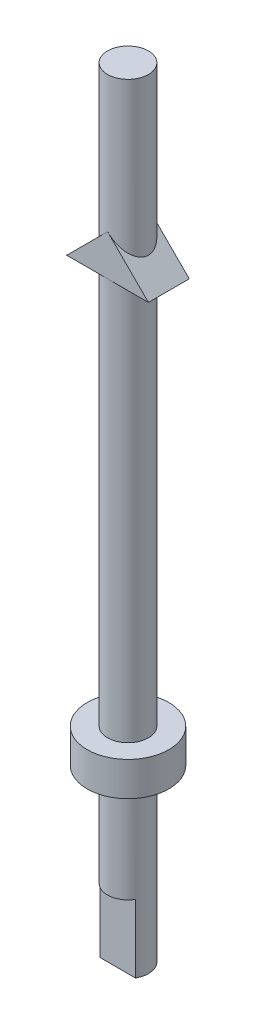
ISO-10303-21;
HEADER;
FILE_DESCRIPTION(('STEP AP214'),'2;1');
FILE_NAME('part.step','',(''),(''),'','','');
FILE_SCHEMA(('AUTOMOTIVE_DESIGN { 1 0 10303 214 1 1 1 1 }'));
ENDSEC;
DATA;
#1=APPLICATION_CONTEXT('core data for automotive mechanical design processes');
#2=APPLICATION_PROTOCOL_DEFINITION('international standard','automotive_design',2000,#1);
#3=PRODUCT_CONTEXT('',#1,'mechanical');
#4=PRODUCT('Part','Part','',(#3));
#5=PRODUCT_RELATED_PRODUCT_CATEGORY('part','',(#4));
#6=PRODUCT_DEFINITION_FORMATION('','',#4);
#7=PRODUCT_DEFINITION_CONTEXT('part definition',#1,'design');
#8=PRODUCT_DEFINITION('design','',#6,#7);
#9=PRODUCT_DEFINITION_SHAPE('','',#8);
#10=(LENGTH_UNIT() NAMED_UNIT(*) SI_UNIT(.MILLI.,.METRE.));
#11=(NAMED_UNIT(*) PLANE_ANGLE_UNIT() SI_UNIT($,.RADIAN.));
#12=(NAMED_UNIT(*) SI_UNIT($,.STERADIAN.) SOLID_ANGLE_UNIT());
#13=UNCERTAINTY_MEASURE_WITH_UNIT(LENGTH_MEASURE(1.E-05),#10,'distance_accuracy_value','');
#14=(GEOMETRIC_REPRESENTATION_CONTEXT(3) GLOBAL_UNCERTAINTY_ASSIGNED_CONTEXT((#13)) GLOBAL_UNIT_ASSIGNED_CONTEXT((#10,
#11,#12)) REPRESENTATION_CONTEXT('',''));
#15=CARTESIAN_POINT('',(0.,0.,0.));
#16=DIRECTION('',(0.,0.,1.));
#17=DIRECTION('',(1.,0.,0.));
#18=AXIS2_PLACEMENT_3D('',#15,#16,#17);
#19=CARTESIAN_POINT('',(408.49364905389,49.6999999999999,408.493649053891));
#20=DIRECTION('',(0.,-1.,0.));
#21=DIRECTION('',(0.,0.,-1.));
#22=AXIS2_PLACEMENT_3D('',#19,#20,#21);
#23=CYLINDRICAL_SURFACE('',#22,1.50000000000002);
#24=CARTESIAN_POINT('',(408.49364905389,17.5,408.493649053891));
#25=DIRECTION('',(0.,1.,0.));
#26=DIRECTION('',(0.,0.,1.));
#27=AXIS2_PLACEMENT_3D('',#24,#25,#26);
#28=CIRCLE('',#27,1.50000000000002);
#29=CARTESIAN_POINT('',(408.49364905389,17.5,409.993649053891));
#30=VERTEX_POINT('',#29);
#31=EDGE_CURVE('E137',#30,#30,#28,.T.);
#32=ORIENTED_EDGE('',*,*,#31,.T.);
#33=EDGE_LOOP('',(#32));
#34=FACE_BOUND('',#33,.T.);
#35=CARTESIAN_POINT('',(408.49364905389,46.6999999999999,408.493649053891));
#36=DIRECTION('',(0.,1.,0.));
#37=DIRECTION('',(0.,0.,1.));
#38=AXIS2_PLACEMENT_3D('',#35,#36,#37);
#39=CIRCLE('',#38,1.50000000000002);
#40=CARTESIAN_POINT('',(408.49364905389,46.6999999999999,409.993649053891));
#41=VERTEX_POINT('',#40);
#42=CARTESIAN_POINT('',(408.49364905389,46.6999999999999,406.993649053891));
#43=VERTEX_POINT('',#42);
#44=EDGE_CURVE('E151',#41,#43,#39,.T.);
#45=ORIENTED_EDGE('',*,*,#44,.F.);
#46=EDGE_CURVE('E54',#43,#41,#39,.T.);
#47=ORIENTED_EDGE('',*,*,#46,.F.);
#48=EDGE_LOOP('',(#45,#47));
#49=FACE_BOUND('',#48,.T.);
#50=ADVANCED_FACE('F35',(#34,#49),#23,.T.);
#51=CARTESIAN_POINT('',(408.49364905389,17.5,408.493649053891));
#52=DIRECTION('',(0.,-1.,0.));
#53=DIRECTION('',(0.,0.,-1.));
#54=AXIS2_PLACEMENT_3D('',#51,#52,#53);
#55=CYLINDRICAL_SURFACE('',#54,2.99999999999999);
#56=CARTESIAN_POINT('',(408.49364905389,17.5,408.493649053891));
#57=DIRECTION('',(0.,1.,0.));
#58=DIRECTION('',(0.,0.,1.));
#59=AXIS2_PLACEMENT_3D('',#56,#57,#58);
#60=CIRCLE('',#59,2.99999999999999);
#61=CARTESIAN_POINT('',(408.49364905389,17.5,411.493649053891));
#62=VERTEX_POINT('',#61);
#63=EDGE_CURVE('E134',#62,#62,#60,.T.);
#64=ORIENTED_EDGE('',*,*,#63,.F.);
#65=EDGE_LOOP('',(#64));
#66=FACE_BOUND('',#65,.T.);
#67=CARTESIAN_POINT('',(408.49364905389,15.,408.493649053891));
#68=DIRECTION('',(0.,1.,0.));
#69=DIRECTION('',(0.,0.,1.));
#70=AXIS2_PLACEMENT_3D('',#67,#68,#69);
#71=CIRCLE('',#70,2.99999999999999);
#72=CARTESIAN_POINT('',(408.49364905389,15.,411.493649053891));
#73=VERTEX_POINT('',#72);
#74=EDGE_CURVE('E133',#73,#73,#71,.T.);
#75=ORIENTED_EDGE('',*,*,#74,.T.);
#76=EDGE_LOOP('',(#75));
#77=FACE_BOUND('',#76,.T.);
#78=ADVANCED_FACE('F173',(#66,#77),#55,.T.);
#79=CARTESIAN_POINT('',(408.49364905389,17.5,408.493649053891));
#80=DIRECTION('',(0.,1.,0.));
#81=DIRECTION('',(0.,0.,1.));
#82=AXIS2_PLACEMENT_3D('',#79,#80,#81);
#83=PLANE('',#82);
#84=ORIENTED_EDGE('',*,*,#31,.F.);
#85=EDGE_LOOP('',(#84));
#86=FACE_BOUND('',#85,.T.);
#87=ORIENTED_EDGE('',*,*,#63,.T.);
#88=EDGE_LOOP('',(#87));
#89=FACE_BOUND('',#88,.T.);
#90=ADVANCED_FACE('F195',(#86,#89),#83,.T.);
#91=CARTESIAN_POINT('',(408.49364905389,15.,408.493649053891));
#92=DIRECTION('',(0.,1.,0.));
#93=DIRECTION('',(0.,0.,1.));
#94=AXIS2_PLACEMENT_3D('',#91,#92,#93);
#95=PLANE('',#94);
#96=CARTESIAN_POINT('',(408.49364905389,15.,408.493649053891));
#97=DIRECTION('',(0.,1.,0.));
#98=DIRECTION('',(0.,0.,1.));
#99=AXIS2_PLACEMENT_3D('',#96,#97,#98);
#100=CIRCLE('',#99,1.50000000000002);
#101=CARTESIAN_POINT('',(408.49364905389,15.,409.993649053891));
#102=VERTEX_POINT('',#101);
#103=EDGE_CURVE('E144',#102,#102,#100,.T.);
#104=ORIENTED_EDGE('',*,*,#103,.T.);
#105=EDGE_LOOP('',(#104));
#106=FACE_BOUND('',#105,.T.);
#107=ORIENTED_EDGE('',*,*,#74,.F.);
#108=EDGE_LOOP('',(#107));
#109=FACE_BOUND('',#108,.T.);
#110=ADVANCED_FACE('F186',(#106,#109),#95,.F.);
#111=CARTESIAN_POINT('',(408.49364905389,2.5,408.493649053891));
#112=DIRECTION('',(0.,1.,0.));
#113=DIRECTION('',(0.,0.,1.));
#114=AXIS2_PLACEMENT_3D('',#111,#112,#113);
#115=PLANE('',#114);
#116=CARTESIAN_POINT('',(408.49364905389,2.5,408.493649053891));
#117=DIRECTION('',(0.,1.,0.));
#118=DIRECTION('',(0.,0.,1.));
#119=AXIS2_PLACEMENT_3D('',#116,#117,#118);
#120=CIRCLE('',#119,1.50000000000002);
#121=CARTESIAN_POINT('',(409.792687159567,2.5,409.243649053891));
#122=VERTEX_POINT('',#121);
#123=CARTESIAN_POINT('',(407.194610948213,2.5,409.243649053891));
#124=VERTEX_POINT('',#123);
#125=EDGE_CURVE('E140',#122,#124,#120,.T.);
#126=ORIENTED_EDGE('',*,*,#125,.F.);
#127=DIRECTION('',(1.,0.,0.));
#128=VECTOR('',#127,1.);
#129=CARTESIAN_POINT('',(407.194610948213,2.5,409.243649053891));
#130=LINE('',#129,#128);
#131=EDGE_CURVE('E105',#124,#122,#130,.T.);
#132=ORIENTED_EDGE('',*,*,#131,.F.);
#133=EDGE_LOOP('',(#126,#132));
#134=FACE_BOUND('',#133,.T.);
#135=ADVANCED_FACE('F177',(#134),#115,.F.);
#136=CARTESIAN_POINT('',(408.49364905389,7.5,408.493649053891));
#137=DIRECTION('',(0.,1.,0.));
#138=DIRECTION('',(0.,0.,1.));
#139=AXIS2_PLACEMENT_3D('',#136,#137,#138);
#140=CIRCLE('',#139,1.50000000000001);
#141=CARTESIAN_POINT('',(409.792687159567,7.5,409.243649053891));
#142=VERTEX_POINT('',#141);
#143=CARTESIAN_POINT('',(407.194610948213,7.5,409.243649053891));
#144=VERTEX_POINT('',#143);
#145=EDGE_CURVE('E127',#142,#144,#140,.F.);
#146=ORIENTED_EDGE('',*,*,#145,.F.);
#147=DIRECTION('',(0.,-1.,0.));
#148=VECTOR('',#147,1.);
#149=CARTESIAN_POINT('',(409.792687159567,10.204163456598,409.243649053891));
#150=LINE('',#149,#148);
#151=EDGE_CURVE('E126',#142,#122,#150,.T.);
#152=ORIENTED_EDGE('',*,*,#151,.T.);
#153=ORIENTED_EDGE('',*,*,#125,.T.);
#154=DIRECTION('',(0.,-1.,0.));
#155=VECTOR('',#154,1.);
#156=CARTESIAN_POINT('',(407.194610948213,10.204163456598,409.243649053891));
#157=LINE('',#156,#155);
#158=EDGE_CURVE('E129',#144,#124,#157,.T.);
#159=ORIENTED_EDGE('',*,*,#158,.F.);
#160=EDGE_LOOP('',(#146,#152,#153,#159));
#161=FACE_BOUND('',#160,.T.);
#162=ORIENTED_EDGE('',*,*,#103,.F.);
#163=EDGE_LOOP('',(#162));
#164=FACE_BOUND('',#163,.T.);
#165=ADVANCED_FACE('F165',(#161,#164),#23,.T.);
#166=CARTESIAN_POINT('',(0.,7.5,0.));
#167=DIRECTION('',(0.,1.,0.));
#168=DIRECTION('',(0.,0.,1.));
#169=AXIS2_PLACEMENT_3D('',#166,#167,#168);
#170=PLANE('',#169);
#171=ORIENTED_EDGE('',*,*,#145,.T.);
#172=DIRECTION('',(1.,0.,0.));
#173=VECTOR('',#172,1.);
#174=CARTESIAN_POINT('',(407.194610948213,7.5,409.243649053891));
#175=LINE('',#174,#173);
#176=EDGE_CURVE('E123',#144,#142,#175,.T.);
#177=ORIENTED_EDGE('',*,*,#176,.T.);
#178=EDGE_LOOP('',(#171,#177));
#179=FACE_BOUND('',#178,.T.);
#180=ADVANCED_FACE('F176',(#179),#170,.F.);
#181=CARTESIAN_POINT('',(407.194610948213,10.204163456598,409.243649053891));
#182=DIRECTION('',(0.,0.,-1.));
#183=DIRECTION('',(-1.,0.,0.));
#184=AXIS2_PLACEMENT_3D('',#181,#182,#183);
#185=PLANE('',#184);
#186=ORIENTED_EDGE('',*,*,#158,.T.);
#187=ORIENTED_EDGE('',*,*,#131,.T.);
#188=ORIENTED_EDGE('',*,*,#151,.F.);
#189=ORIENTED_EDGE('',*,*,#176,.F.);
#190=EDGE_LOOP('',(#186,#187,#188,#189));
#191=FACE_BOUND('',#190,.T.);
#192=ADVANCED_FACE('F183',(#191),#185,.F.);
#193=CARTESIAN_POINT('',(411.49364905389,46.6999999999999,409.993649053891));
#194=DIRECTION('',(0.,1.,0.));
#195=DIRECTION('',(0.,0.,1.));
#196=AXIS2_PLACEMENT_3D('',#193,#194,#195);
#197=PLANE('',#196);
#198=DIRECTION('',(1.,0.,0.));
#199=VECTOR('',#198,1.);
#200=CARTESIAN_POINT('',(411.49364905389,46.6999999999999,409.993649053891));
#201=LINE('',#200,#199);
#202=CARTESIAN_POINT('',(411.49364905389,46.6999999999999,409.993649053891));
#203=VERTEX_POINT('',#202);
#204=EDGE_CURVE('E95',#41,#203,#201,.T.);
#205=ORIENTED_EDGE('',*,*,#204,.F.);
#206=ORIENTED_EDGE('',*,*,#44,.T.);
#207=DIRECTION('',(1.,0.,0.));
#208=VECTOR('',#207,1.);
#209=CARTESIAN_POINT('',(411.49364905389,46.6999999999999,406.993649053891));
#210=LINE('',#209,#208);
#211=CARTESIAN_POINT('',(411.49364905389,46.6999999999999,406.993649053891));
#212=VERTEX_POINT('',#211);
#213=EDGE_CURVE('E119',#43,#212,#210,.T.);
#214=ORIENTED_EDGE('',*,*,#213,.T.);
#215=DIRECTION('',(0.,0.,-1.));
#216=VECTOR('',#215,1.);
#217=CARTESIAN_POINT('',(411.49364905389,46.6999999999999,409.993649053891));
#218=LINE('',#217,#216);
#219=EDGE_CURVE('E106',#203,#212,#218,.T.);
#220=ORIENTED_EDGE('',*,*,#219,.F.);
#221=EDGE_LOOP('',(#205,#206,#214,#220));
#222=FACE_BOUND('',#221,.T.);
#223=ADVANCED_FACE('F154',(#222),#197,.F.);
#224=CARTESIAN_POINT('',(0.,0.,409.993649053891));
#225=DIRECTION('',(0.,0.,1.));
#226=DIRECTION('',(1.,0.,0.));
#227=AXIS2_PLACEMENT_3D('',#224,#225,#226);
#228=PLANE('',#227);
#229=CARTESIAN_POINT('',(405.49364905389,46.6999999999999,409.993649053891));
#230=VERTEX_POINT('',#229);
#231=EDGE_CURVE('E91',#230,#41,#201,.T.);
#232=ORIENTED_EDGE('',*,*,#231,.T.);
#233=ORIENTED_EDGE('',*,*,#204,.T.);
#234=DIRECTION('',(-0.707106781186521,0.707106781186574,0.));
#235=VECTOR('',#234,1.);
#236=CARTESIAN_POINT('',(408.49364905389,49.6999999999999,409.993649053891));
#237=LINE('',#236,#235);
#238=CARTESIAN_POINT('',(408.49364905389,49.6999999999999,409.993649053891));
#239=VERTEX_POINT('',#238);
#240=EDGE_CURVE('E93',#203,#239,#237,.T.);
#241=ORIENTED_EDGE('',*,*,#240,.T.);
#242=DIRECTION('',(-0.707106781186547,-0.707106781186547,0.));
#243=VECTOR('',#242,1.);
#244=CARTESIAN_POINT('',(405.49364905389,46.6999999999999,409.993649053891));
#245=LINE('',#244,#243);
#246=EDGE_CURVE('E87',#239,#230,#245,.T.);
#247=ORIENTED_EDGE('',*,*,#246,.T.);
#248=EDGE_LOOP('',(#232,#233,#241,#247));
#249=FACE_BOUND('',#248,.T.);
#250=ADVANCED_FACE('F89',(#249),#228,.T.);
#251=CARTESIAN_POINT('',(0.,0.,406.993649053891));
#252=DIRECTION('',(0.,0.,1.));
#253=DIRECTION('',(1.,0.,0.));
#254=AXIS2_PLACEMENT_3D('',#251,#252,#253);
#255=PLANE('',#254);
#256=DIRECTION('',(-0.707106781186547,-0.707106781186547,0.));
#257=VECTOR('',#256,1.);
#258=CARTESIAN_POINT('',(405.49364905389,46.6999999999999,406.993649053891));
#259=LINE('',#258,#257);
#260=CARTESIAN_POINT('',(408.49364905389,49.6999999999999,406.993649053891));
#261=VERTEX_POINT('',#260);
#262=CARTESIAN_POINT('',(405.49364905389,46.6999999999999,406.993649053891));
#263=VERTEX_POINT('',#262);
#264=EDGE_CURVE('E101',#261,#263,#259,.T.);
#265=ORIENTED_EDGE('',*,*,#264,.F.);
#266=DIRECTION('',(-0.707106781186521,0.707106781186574,0.));
#267=VECTOR('',#266,1.);
#268=CARTESIAN_POINT('',(408.49364905389,49.6999999999999,406.993649053891));
#269=LINE('',#268,#267);
#270=EDGE_CURVE('E115',#212,#261,#269,.T.);
#271=ORIENTED_EDGE('',*,*,#270,.F.);
#272=ORIENTED_EDGE('',*,*,#213,.F.);
#273=EDGE_CURVE('E120',#263,#43,#210,.T.);
#274=ORIENTED_EDGE('',*,*,#273,.F.);
#275=EDGE_LOOP('',(#265,#271,#272,#274));
#276=FACE_BOUND('',#275,.T.);
#277=ADVANCED_FACE('F158',(#276),#255,.F.);
#278=CARTESIAN_POINT('',(408.49364905389,49.6999999999999,409.993649053891));
#279=DIRECTION('',(-0.707106781186574,-0.707106781186521,0.));
#280=DIRECTION('',(0.707106781186521,-0.707106781186574,0.));
#281=AXIS2_PLACEMENT_3D('',#278,#279,#280);
#282=PLANE('',#281);
#283=ORIENTED_EDGE('',*,*,#270,.T.);
#284=CARTESIAN_POINT('',(408.49364905389,49.7,408.493649053891));
#285=DIRECTION('',(-0.707106781186574,-0.707106781186521,0.));
#286=DIRECTION('',(0.707106781186521,-0.707106781186574,0.));
#287=AXIS2_PLACEMENT_3D('',#284,#285,#286);
#288=ELLIPSE('',#287,2.12132034355976,1.50000000000002);
#289=EDGE_CURVE('E12',#261,#239,#288,.T.);
#290=ORIENTED_EDGE('',*,*,#289,.T.);
#291=ORIENTED_EDGE('',*,*,#240,.F.);
#292=ORIENTED_EDGE('',*,*,#219,.T.);
#293=EDGE_LOOP('',(#283,#290,#291,#292));
#294=FACE_BOUND('',#293,.T.);
#295=ADVANCED_FACE('F160',(#294),#282,.F.);
#296=CARTESIAN_POINT('',(405.49364905389,46.6999999999999,409.993649053891));
#297=DIRECTION('',(0.707106781186548,-0.707106781186548,0.));
#298=DIRECTION('',(0.707106781186548,0.707106781186548,0.));
#299=AXIS2_PLACEMENT_3D('',#296,#297,#298);
#300=PLANE('',#299);
#301=ORIENTED_EDGE('',*,*,#246,.F.);
#302=CARTESIAN_POINT('',(408.49364905389,49.6999999999998,408.493649053891));
#303=DIRECTION('',(0.707106781186548,-0.707106781186548,0.));
#304=DIRECTION('',(-0.707106781186548,-0.707106781186548,0.));
#305=AXIS2_PLACEMENT_3D('',#302,#303,#304);
#306=ELLIPSE('',#305,2.12132034355968,1.50000000000002);
#307=EDGE_CURVE('E43',#239,#261,#306,.T.);
#308=ORIENTED_EDGE('',*,*,#307,.T.);
#309=ORIENTED_EDGE('',*,*,#264,.T.);
#310=DIRECTION('',(0.,0.,-1.));
#311=VECTOR('',#310,1.);
#312=CARTESIAN_POINT('',(405.49364905389,46.6999999999999,409.993649053891));
#313=LINE('',#312,#311);
#314=EDGE_CURVE('E98',#230,#263,#313,.T.);
#315=ORIENTED_EDGE('',*,*,#314,.F.);
#316=EDGE_LOOP('',(#301,#308,#309,#315));
#317=FACE_BOUND('',#316,.T.);
#318=ADVANCED_FACE('F99',(#317),#300,.F.);
#319=ORIENTED_EDGE('',*,*,#273,.T.);
#320=ORIENTED_EDGE('',*,*,#46,.T.);
#321=ORIENTED_EDGE('',*,*,#231,.F.);
#322=ORIENTED_EDGE('',*,*,#314,.T.);
#323=EDGE_LOOP('',(#319,#320,#321,#322));
#324=FACE_BOUND('',#323,.T.);
#325=ADVANCED_FACE('F108',(#324),#197,.F.);
#326=CARTESIAN_POINT('',(408.49364905389,59.6999999999999,408.493649053891));
#327=DIRECTION('',(0.,1.,0.));
#328=DIRECTION('',(0.,0.,1.));
#329=AXIS2_PLACEMENT_3D('',#326,#327,#328);
#330=PLANE('',#329);
#331=CARTESIAN_POINT('',(408.49364905389,59.6999999999999,408.493649053891));
#332=DIRECTION('',(0.,1.,0.));
#333=DIRECTION('',(0.,0.,1.));
#334=AXIS2_PLACEMENT_3D('',#331,#332,#333);
#335=CIRCLE('',#334,1.50000000000002);
#336=CARTESIAN_POINT('',(408.49364905389,59.6999999999999,409.993649053891));
#337=VERTEX_POINT('',#336);
#338=EDGE_CURVE('E143',#337,#337,#335,.T.);
#339=ORIENTED_EDGE('',*,*,#338,.T.);
#340=EDGE_LOOP('',(#339));
#341=FACE_BOUND('',#340,.T.);
#342=ADVANCED_FACE('F37',(#341),#330,.T.);
#343=ORIENTED_EDGE('',*,*,#338,.F.);
#344=EDGE_LOOP('',(#343));
#345=FACE_BOUND('',#344,.T.);
#346=ORIENTED_EDGE('',*,*,#289,.F.);
#347=ORIENTED_EDGE('',*,*,#307,.F.);
#348=EDGE_LOOP('',(#346,#347));
#349=FACE_BOUND('',#348,.T.);
#350=ADVANCED_FACE('F161',(#345,#349),#23,.T.);
#351=CLOSED_SHELL('',(#50,#78,#90,#110,#135,#165,#180,#192,#223,#250,#277,#295,#318,#325,#342,#350));
#352=MANIFOLD_SOLID_BREP('B2',#351);
#353=ADVANCED_BREP_SHAPE_REPRESENTATION('',(#18,#352),#14);
#354=SHAPE_DEFINITION_REPRESENTATION(#9,#353);
ENDSEC;
END-ISO-10303-21;
